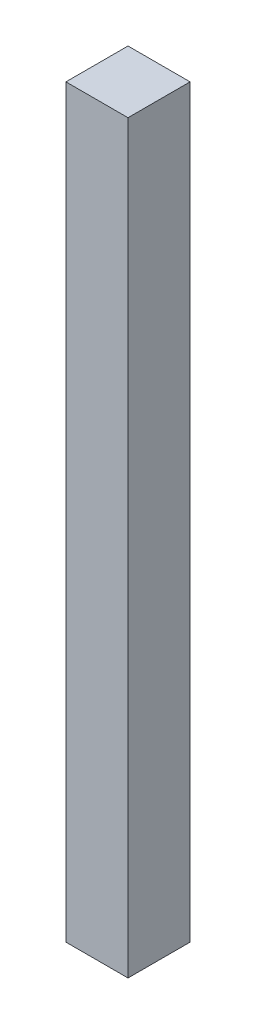
ISO-10303-21;
HEADER;
FILE_DESCRIPTION(('STEP AP214'),'2;1');
FILE_NAME('part.step','',(''),(''),'','','');
FILE_SCHEMA(('AUTOMOTIVE_DESIGN { 1 0 10303 214 1 1 1 1 }'));
ENDSEC;
DATA;
#1=APPLICATION_CONTEXT('core data for automotive mechanical design processes');
#2=APPLICATION_PROTOCOL_DEFINITION('international standard','automotive_design',2000,#1);
#3=PRODUCT_CONTEXT('',#1,'mechanical');
#4=PRODUCT('Part','Part','',(#3));
#5=PRODUCT_RELATED_PRODUCT_CATEGORY('part','',(#4));
#6=PRODUCT_DEFINITION_FORMATION('','',#4);
#7=PRODUCT_DEFINITION_CONTEXT('part definition',#1,'design');
#8=PRODUCT_DEFINITION('design','',#6,#7);
#9=PRODUCT_DEFINITION_SHAPE('','',#8);
#10=(LENGTH_UNIT() NAMED_UNIT(*) SI_UNIT(.MILLI.,.METRE.));
#11=(NAMED_UNIT(*) PLANE_ANGLE_UNIT() SI_UNIT($,.RADIAN.));
#12=(NAMED_UNIT(*) SI_UNIT($,.STERADIAN.) SOLID_ANGLE_UNIT());
#13=UNCERTAINTY_MEASURE_WITH_UNIT(LENGTH_MEASURE(1.E-05),#10,'distance_accuracy_value','');
#14=(GEOMETRIC_REPRESENTATION_CONTEXT(3) GLOBAL_UNCERTAINTY_ASSIGNED_CONTEXT((#13)) GLOBAL_UNIT_ASSIGNED_CONTEXT((#10,
#11,#12)) REPRESENTATION_CONTEXT('',''));
#15=CARTESIAN_POINT('',(0.,0.,0.));
#16=DIRECTION('',(0.,0.,1.));
#17=DIRECTION('',(1.,0.,0.));
#18=AXIS2_PLACEMENT_3D('',#15,#16,#17);
#19=CARTESIAN_POINT('',(-14.6706829003742,304.8,20.4604232651865));
#20=DIRECTION('',(0.,0.,-1.));
#21=DIRECTION('',(-1.,0.,0.));
#22=AXIS2_PLACEMENT_3D('',#19,#20,#21);
#23=PLANE('',#22);
#24=DIRECTION('',(1.,0.,0.));
#25=VECTOR('',#24,1.);
#26=CARTESIAN_POINT('',(-14.6706829003742,0.,20.4604232651865));
#27=LINE('',#26,#25);
#28=CARTESIAN_POINT('',(-14.6706829003742,0.,20.4604232651865));
#29=VERTEX_POINT('',#28);
#30=CARTESIAN_POINT('',(10.7293170996258,0.,20.4604232651865));
#31=VERTEX_POINT('',#30);
#32=EDGE_CURVE('E106',#29,#31,#27,.T.);
#33=ORIENTED_EDGE('',*,*,#32,.T.);
#34=DIRECTION('',(0.,-1.,0.));
#35=VECTOR('',#34,1.);
#36=CARTESIAN_POINT('',(10.7293170996258,304.8,20.4604232651865));
#37=LINE('',#36,#35);
#38=CARTESIAN_POINT('',(10.7293170996258,304.8,20.4604232651865));
#39=VERTEX_POINT('',#38);
#40=EDGE_CURVE('E11',#39,#31,#37,.T.);
#41=ORIENTED_EDGE('',*,*,#40,.F.);
#42=DIRECTION('',(1.,0.,0.));
#43=VECTOR('',#42,1.);
#44=CARTESIAN_POINT('',(-14.6706829003742,304.8,20.4604232651865));
#45=LINE('',#44,#43);
#46=CARTESIAN_POINT('',(-14.6706829003742,304.8,20.4604232651865));
#47=VERTEX_POINT('',#46);
#48=EDGE_CURVE('E79',#47,#39,#45,.T.);
#49=ORIENTED_EDGE('',*,*,#48,.F.);
#50=DIRECTION('',(0.,-1.,0.));
#51=VECTOR('',#50,1.);
#52=CARTESIAN_POINT('',(-14.6706829003742,304.8,20.4604232651865));
#53=LINE('',#52,#51);
#54=EDGE_CURVE('E102',#47,#29,#53,.T.);
#55=ORIENTED_EDGE('',*,*,#54,.T.);
#56=EDGE_LOOP('',(#33,#41,#49,#55));
#57=FACE_BOUND('',#56,.T.);
#58=ADVANCED_FACE('F39',(#57),#23,.F.);
#59=CARTESIAN_POINT('',(10.7293170996258,304.8,-4.93957673481345));
#60=DIRECTION('',(1.,0.,0.));
#61=DIRECTION('',(0.,0.,-1.));
#62=AXIS2_PLACEMENT_3D('',#59,#60,#61);
#63=PLANE('',#62);
#64=DIRECTION('',(0.,0.,1.));
#65=VECTOR('',#64,1.);
#66=CARTESIAN_POINT('',(10.7293170996258,0.,-4.93957673481345));
#67=LINE('',#66,#65);
#68=CARTESIAN_POINT('',(10.7293170996258,0.,-4.93957673481345));
#69=VERTEX_POINT('',#68);
#70=EDGE_CURVE('E88',#69,#31,#67,.T.);
#71=ORIENTED_EDGE('',*,*,#70,.F.);
#72=DIRECTION('',(0.,-1.,0.));
#73=VECTOR('',#72,1.);
#74=CARTESIAN_POINT('',(10.7293170996258,304.8,-4.93957673481345));
#75=LINE('',#74,#73);
#76=CARTESIAN_POINT('',(10.7293170996258,304.8,-4.93957673481345));
#77=VERTEX_POINT('',#76);
#78=EDGE_CURVE('E48',#77,#69,#75,.T.);
#79=ORIENTED_EDGE('',*,*,#78,.F.);
#80=DIRECTION('',(0.,0.,1.));
#81=VECTOR('',#80,1.);
#82=CARTESIAN_POINT('',(10.7293170996258,304.8,-4.93957673481345));
#83=LINE('',#82,#81);
#84=EDGE_CURVE('E86',#77,#39,#83,.T.);
#85=ORIENTED_EDGE('',*,*,#84,.T.);
#86=ORIENTED_EDGE('',*,*,#40,.T.);
#87=EDGE_LOOP('',(#71,#79,#85,#86));
#88=FACE_BOUND('',#87,.T.);
#89=ADVANCED_FACE('F85',(#88),#63,.T.);
#90=CARTESIAN_POINT('',(-14.6706829003742,304.8,-4.93957673481345));
#91=DIRECTION('',(0.,0.,-1.));
#92=DIRECTION('',(-1.,0.,0.));
#93=AXIS2_PLACEMENT_3D('',#90,#91,#92);
#94=PLANE('',#93);
#95=DIRECTION('',(1.,0.,0.));
#96=VECTOR('',#95,1.);
#97=CARTESIAN_POINT('',(-14.6706829003742,0.,-4.93957673481345));
#98=LINE('',#97,#96);
#99=CARTESIAN_POINT('',(-14.6706829003742,0.,-4.93957673481345));
#100=VERTEX_POINT('',#99);
#101=EDGE_CURVE('E112',#100,#69,#98,.T.);
#102=ORIENTED_EDGE('',*,*,#101,.F.);
#103=DIRECTION('',(0.,-1.,0.));
#104=VECTOR('',#103,1.);
#105=CARTESIAN_POINT('',(-14.6706829003742,304.8,-4.93957673481345));
#106=LINE('',#105,#104);
#107=CARTESIAN_POINT('',(-14.6706829003742,304.8,-4.93957673481345));
#108=VERTEX_POINT('',#107);
#109=EDGE_CURVE('E71',#108,#100,#106,.T.);
#110=ORIENTED_EDGE('',*,*,#109,.F.);
#111=DIRECTION('',(1.,0.,0.));
#112=VECTOR('',#111,1.);
#113=CARTESIAN_POINT('',(-14.6706829003742,304.8,-4.93957673481345));
#114=LINE('',#113,#112);
#115=EDGE_CURVE('E95',#108,#77,#114,.T.);
#116=ORIENTED_EDGE('',*,*,#115,.T.);
#117=ORIENTED_EDGE('',*,*,#78,.T.);
#118=EDGE_LOOP('',(#102,#110,#116,#117));
#119=FACE_BOUND('',#118,.T.);
#120=ADVANCED_FACE('F98',(#119),#94,.T.);
#121=CARTESIAN_POINT('',(-14.6706829003742,304.8,-4.93957673481345));
#122=DIRECTION('',(1.,0.,0.));
#123=DIRECTION('',(0.,0.,-1.));
#124=AXIS2_PLACEMENT_3D('',#121,#122,#123);
#125=PLANE('',#124);
#126=DIRECTION('',(0.,0.,1.));
#127=VECTOR('',#126,1.);
#128=CARTESIAN_POINT('',(-14.6706829003742,0.,-4.93957673481345));
#129=LINE('',#128,#127);
#130=EDGE_CURVE('E74',#100,#29,#129,.T.);
#131=ORIENTED_EDGE('',*,*,#130,.T.);
#132=ORIENTED_EDGE('',*,*,#54,.F.);
#133=DIRECTION('',(0.,0.,1.));
#134=VECTOR('',#133,1.);
#135=CARTESIAN_POINT('',(-14.6706829003742,304.8,-4.93957673481345));
#136=LINE('',#135,#134);
#137=EDGE_CURVE('E56',#108,#47,#136,.T.);
#138=ORIENTED_EDGE('',*,*,#137,.F.);
#139=ORIENTED_EDGE('',*,*,#109,.T.);
#140=EDGE_LOOP('',(#131,#132,#138,#139));
#141=FACE_BOUND('',#140,.T.);
#142=ADVANCED_FACE('F129',(#141),#125,.F.);
#143=CARTESIAN_POINT('',(0.,304.8,0.));
#144=DIRECTION('',(0.,-1.,0.));
#145=DIRECTION('',(0.,0.,-1.));
#146=AXIS2_PLACEMENT_3D('',#143,#144,#145);
#147=PLANE('',#146);
#148=ORIENTED_EDGE('',*,*,#48,.T.);
#149=ORIENTED_EDGE('',*,*,#84,.F.);
#150=ORIENTED_EDGE('',*,*,#115,.F.);
#151=ORIENTED_EDGE('',*,*,#137,.T.);
#152=EDGE_LOOP('',(#148,#149,#150,#151));
#153=FACE_BOUND('',#152,.T.);
#154=ADVANCED_FACE('F94',(#153),#147,.F.);
#155=CARTESIAN_POINT('',(0.,0.,0.));
#156=DIRECTION('',(0.,-1.,0.));
#157=DIRECTION('',(0.,0.,-1.));
#158=AXIS2_PLACEMENT_3D('',#155,#156,#157);
#159=PLANE('',#158);
#160=ORIENTED_EDGE('',*,*,#32,.F.);
#161=ORIENTED_EDGE('',*,*,#130,.F.);
#162=ORIENTED_EDGE('',*,*,#101,.T.);
#163=ORIENTED_EDGE('',*,*,#70,.T.);
#164=EDGE_LOOP('',(#160,#161,#162,#163));
#165=FACE_BOUND('',#164,.T.);
#166=ADVANCED_FACE('F123',(#165),#159,.T.);
#167=CLOSED_SHELL('',(#58,#89,#120,#142,#154,#166));
#168=MANIFOLD_SOLID_BREP('B2',#167);
#169=ADVANCED_BREP_SHAPE_REPRESENTATION('',(#18,#168),#14);
#170=SHAPE_DEFINITION_REPRESENTATION(#9,#169);
ENDSEC;
END-ISO-10303-21;
